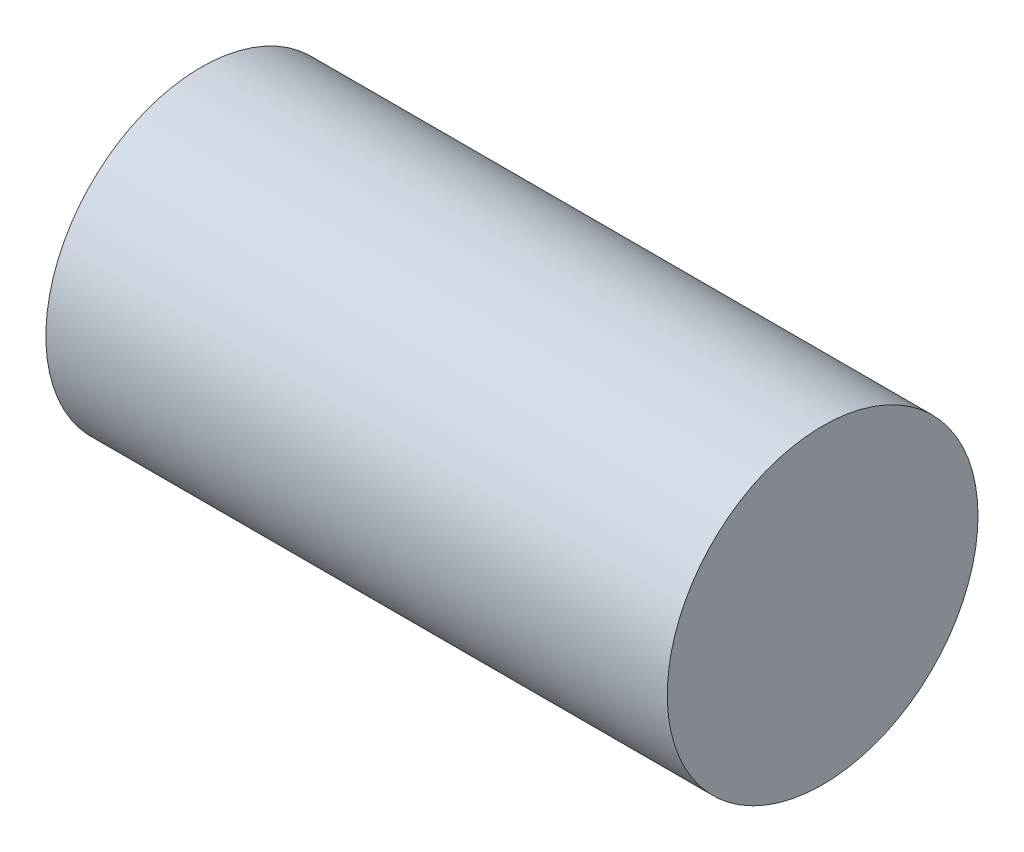
ISO-10303-21;
HEADER;
FILE_DESCRIPTION(('STEP AP214'),'2;1');
FILE_NAME('part.step','',(''),(''),'','','');
FILE_SCHEMA(('AUTOMOTIVE_DESIGN { 1 0 10303 214 1 1 1 1 }'));
ENDSEC;
DATA;
#1=APPLICATION_CONTEXT('core data for automotive mechanical design processes');
#2=APPLICATION_PROTOCOL_DEFINITION('international standard','automotive_design',2000,#1);
#3=PRODUCT_CONTEXT('',#1,'mechanical');
#4=PRODUCT('Part','Part','',(#3));
#5=PRODUCT_RELATED_PRODUCT_CATEGORY('part','',(#4));
#6=PRODUCT_DEFINITION_FORMATION('','',#4);
#7=PRODUCT_DEFINITION_CONTEXT('part definition',#1,'design');
#8=PRODUCT_DEFINITION('design','',#6,#7);
#9=PRODUCT_DEFINITION_SHAPE('','',#8);
#10=(LENGTH_UNIT() NAMED_UNIT(*) SI_UNIT(.MILLI.,.METRE.));
#11=(NAMED_UNIT(*) PLANE_ANGLE_UNIT() SI_UNIT($,.RADIAN.));
#12=(NAMED_UNIT(*) SI_UNIT($,.STERADIAN.) SOLID_ANGLE_UNIT());
#13=UNCERTAINTY_MEASURE_WITH_UNIT(LENGTH_MEASURE(1.E-05),#10,'distance_accuracy_value','');
#14=(GEOMETRIC_REPRESENTATION_CONTEXT(3) GLOBAL_UNCERTAINTY_ASSIGNED_CONTEXT((#13)) GLOBAL_UNIT_ASSIGNED_CONTEXT((#10,
#11,#12)) REPRESENTATION_CONTEXT('',''));
#15=CARTESIAN_POINT('',(0.,0.,0.));
#16=DIRECTION('',(0.,0.,1.));
#17=DIRECTION('',(1.,0.,0.));
#18=AXIS2_PLACEMENT_3D('',#15,#16,#17);
#19=CARTESIAN_POINT('',(4.,0.,0.));
#20=DIRECTION('',(-1.,0.,0.));
#21=DIRECTION('',(0.,0.,1.));
#22=AXIS2_PLACEMENT_3D('',#19,#20,#21);
#23=CYLINDRICAL_SURFACE('',#22,1.);
#24=CARTESIAN_POINT('',(4.,0.,0.));
#25=DIRECTION('',(1.,0.,0.));
#26=DIRECTION('',(0.,0.,-1.));
#27=AXIS2_PLACEMENT_3D('',#24,#25,#26);
#28=CIRCLE('',#27,1.);
#29=CARTESIAN_POINT('',(4.,0.,-1.));
#30=VERTEX_POINT('',#29);
#31=EDGE_CURVE('E10',#30,#30,#28,.T.);
#32=ORIENTED_EDGE('',*,*,#31,.F.);
#33=EDGE_LOOP('',(#32));
#34=FACE_BOUND('',#33,.T.);
#35=CARTESIAN_POINT('',(0.,0.,0.));
#36=DIRECTION('',(1.,0.,0.));
#37=DIRECTION('',(0.,0.,-1.));
#38=AXIS2_PLACEMENT_3D('',#35,#36,#37);
#39=CIRCLE('',#38,1.);
#40=CARTESIAN_POINT('',(0.,0.,-1.));
#41=VERTEX_POINT('',#40);
#42=EDGE_CURVE('E34',#41,#41,#39,.T.);
#43=ORIENTED_EDGE('',*,*,#42,.T.);
#44=EDGE_LOOP('',(#43));
#45=FACE_BOUND('',#44,.T.);
#46=ADVANCED_FACE('F31',(#34,#45),#23,.T.);
#47=CARTESIAN_POINT('',(4.,0.,0.));
#48=DIRECTION('',(1.,0.,0.));
#49=DIRECTION('',(0.,0.,-1.));
#50=AXIS2_PLACEMENT_3D('',#47,#48,#49);
#51=PLANE('',#50);
#52=ORIENTED_EDGE('',*,*,#31,.T.);
#53=EDGE_LOOP('',(#52));
#54=FACE_BOUND('',#53,.T.);
#55=ADVANCED_FACE('F46',(#54),#51,.T.);
#56=CARTESIAN_POINT('',(0.,0.,0.));
#57=DIRECTION('',(1.,0.,0.));
#58=DIRECTION('',(0.,0.,-1.));
#59=AXIS2_PLACEMENT_3D('',#56,#57,#58);
#60=PLANE('',#59);
#61=ORIENTED_EDGE('',*,*,#42,.F.);
#62=EDGE_LOOP('',(#61));
#63=FACE_BOUND('',#62,.T.);
#64=ADVANCED_FACE('F44',(#63),#60,.F.);
#65=CLOSED_SHELL('',(#46,#55,#64));
#66=MANIFOLD_SOLID_BREP('B2',#65);
#67=ADVANCED_BREP_SHAPE_REPRESENTATION('',(#18,#66),#14);
#68=SHAPE_DEFINITION_REPRESENTATION(#9,#67);
ENDSEC;
END-ISO-10303-21;
